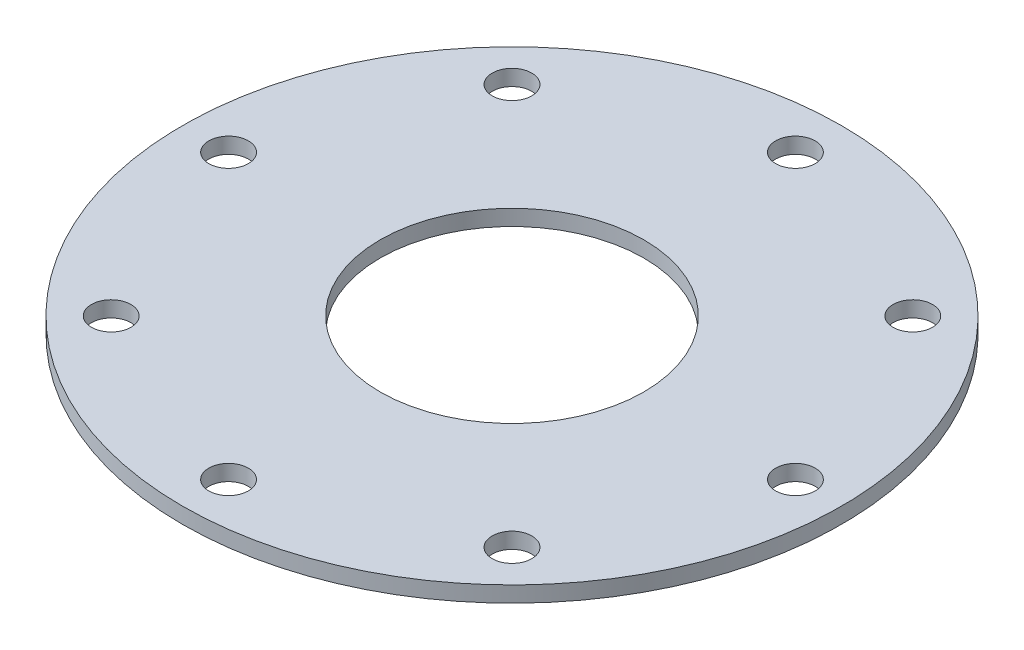
ISO-10303-21;
HEADER;
FILE_DESCRIPTION(('STEP AP214'),'2;1');
FILE_NAME('part.step','',(''),(''),'','','');
FILE_SCHEMA(('AUTOMOTIVE_DESIGN { 1 0 10303 214 1 1 1 1 }'));
ENDSEC;
DATA;
#1=APPLICATION_CONTEXT('core data for automotive mechanical design processes');
#2=APPLICATION_PROTOCOL_DEFINITION('international standard','automotive_design',2000,#1);
#3=PRODUCT_CONTEXT('',#1,'mechanical');
#4=PRODUCT('Part','Part','',(#3));
#5=PRODUCT_RELATED_PRODUCT_CATEGORY('part','',(#4));
#6=PRODUCT_DEFINITION_FORMATION('','',#4);
#7=PRODUCT_DEFINITION_CONTEXT('part definition',#1,'design');
#8=PRODUCT_DEFINITION('design','',#6,#7);
#9=PRODUCT_DEFINITION_SHAPE('','',#8);
#10=(LENGTH_UNIT() NAMED_UNIT(*) SI_UNIT(.MILLI.,.METRE.));
#11=(NAMED_UNIT(*) PLANE_ANGLE_UNIT() SI_UNIT($,.RADIAN.));
#12=(NAMED_UNIT(*) SI_UNIT($,.STERADIAN.) SOLID_ANGLE_UNIT());
#13=UNCERTAINTY_MEASURE_WITH_UNIT(LENGTH_MEASURE(1.E-05),#10,'distance_accuracy_value','');
#14=(GEOMETRIC_REPRESENTATION_CONTEXT(3) GLOBAL_UNCERTAINTY_ASSIGNED_CONTEXT((#13)) GLOBAL_UNIT_ASSIGNED_CONTEXT((#10,
#11,#12)) REPRESENTATION_CONTEXT('',''));
#15=CARTESIAN_POINT('',(0.,0.,0.));
#16=DIRECTION('',(0.,0.,1.));
#17=DIRECTION('',(1.,0.,0.));
#18=AXIS2_PLACEMENT_3D('',#15,#16,#17);
#19=CARTESIAN_POINT('',(0.,6.,0.));
#20=DIRECTION('',(0.,-1.,0.));
#21=DIRECTION('',(0.,0.,-1.));
#22=AXIS2_PLACEMENT_3D('',#19,#20,#21);
#23=CYLINDRICAL_SURFACE('',#22,125.);
#24=CARTESIAN_POINT('',(0.,6.,0.));
#25=DIRECTION('',(0.,1.,0.));
#26=DIRECTION('',(0.,0.,1.));
#27=AXIS2_PLACEMENT_3D('',#24,#25,#26);
#28=CIRCLE('',#27,125.);
#29=CARTESIAN_POINT('',(0.,6.,125.));
#30=VERTEX_POINT('',#29);
#31=EDGE_CURVE('E10',#30,#30,#28,.T.);
#32=ORIENTED_EDGE('',*,*,#31,.F.);
#33=EDGE_LOOP('',(#32));
#34=FACE_BOUND('',#33,.T.);
#35=CARTESIAN_POINT('',(0.,0.,0.));
#36=DIRECTION('',(0.,1.,0.));
#37=DIRECTION('',(0.,0.,1.));
#38=AXIS2_PLACEMENT_3D('',#35,#36,#37);
#39=CIRCLE('',#38,125.);
#40=CARTESIAN_POINT('',(0.,0.,125.));
#41=VERTEX_POINT('',#40);
#42=EDGE_CURVE('E35',#41,#41,#39,.T.);
#43=ORIENTED_EDGE('',*,*,#42,.T.);
#44=EDGE_LOOP('',(#43));
#45=FACE_BOUND('',#44,.T.);
#46=ADVANCED_FACE('F32',(#34,#45),#23,.T.);
#47=CARTESIAN_POINT('',(0.,6.,0.));
#48=DIRECTION('',(0.,1.,0.));
#49=DIRECTION('',(0.,0.,1.));
#50=AXIS2_PLACEMENT_3D('',#47,#48,#49);
#51=PLANE('',#50);
#52=CARTESIAN_POINT('',(-107.5,6.,3.75334243925637E-13));
#53=DIRECTION('',(0.,1.,0.));
#54=DIRECTION('',(1.,0.,0.));
#55=AXIS2_PLACEMENT_3D('',#52,#53,#54);
#56=CIRCLE('',#55,7.5);
#57=CARTESIAN_POINT('',(-100.,6.,3.49148133884313E-13));
#58=VERTEX_POINT('',#57);
#59=EDGE_CURVE('E61',#58,#58,#56,.T.);
#60=ORIENTED_EDGE('',*,*,#59,.F.);
#61=EDGE_LOOP('',(#60));
#62=FACE_BOUND('',#61,.T.);
#63=CARTESIAN_POINT('',(-76.0139789775534,6.,76.0139789775543));
#64=DIRECTION('',(0.,1.,0.));
#65=DIRECTION('',(0.707106781186544,0.,-0.707106781186551));
#66=AXIS2_PLACEMENT_3D('',#63,#64,#65);
#67=CIRCLE('',#66,7.5);
#68=CARTESIAN_POINT('',(-70.7106781186544,6.,70.7106781186551));
#69=VERTEX_POINT('',#68);
#70=EDGE_CURVE('E76',#69,#69,#67,.T.);
#71=ORIENTED_EDGE('',*,*,#70,.F.);
#72=EDGE_LOOP('',(#71));
#73=FACE_BOUND('',#72,.T.);
#74=CARTESIAN_POINT('',(0.,6.,107.5));
#75=DIRECTION('',(0.,1.,0.));
#76=DIRECTION('',(0.,0.,-1.));
#77=AXIS2_PLACEMENT_3D('',#74,#75,#76);
#78=CIRCLE('',#77,7.5);
#79=CARTESIAN_POINT('',(0.,6.,100.));
#80=VERTEX_POINT('',#79);
#81=EDGE_CURVE('E70',#80,#80,#78,.T.);
#82=ORIENTED_EDGE('',*,*,#81,.F.);
#83=EDGE_LOOP('',(#82));
#84=FACE_BOUND('',#83,.T.);
#85=CARTESIAN_POINT('',(76.0139789775545,6.,76.0139789775532));
#86=DIRECTION('',(0.,1.,0.));
#87=DIRECTION('',(-0.707106781186554,0.,-0.707106781186541));
#88=AXIS2_PLACEMENT_3D('',#85,#86,#87);
#89=CIRCLE('',#88,7.5);
#90=CARTESIAN_POINT('',(70.7106781186554,6.,70.7106781186541));
#91=VERTEX_POINT('',#90);
#92=EDGE_CURVE('E62',#91,#91,#89,.T.);
#93=ORIENTED_EDGE('',*,*,#92,.F.);
#94=EDGE_LOOP('',(#93));
#95=FACE_BOUND('',#94,.T.);
#96=CARTESIAN_POINT('',(107.5,6.,-1.12600273177691E-12));
#97=DIRECTION('',(0.,1.,0.));
#98=DIRECTION('',(-1.,0.,0.));
#99=AXIS2_PLACEMENT_3D('',#96,#97,#98);
#100=CIRCLE('',#99,7.5);
#101=CARTESIAN_POINT('',(100.,6.,-1.04744440165294E-12));
#102=VERTEX_POINT('',#101);
#103=EDGE_CURVE('E69',#102,#102,#100,.T.);
#104=ORIENTED_EDGE('',*,*,#103,.F.);
#105=EDGE_LOOP('',(#104));
#106=FACE_BOUND('',#105,.T.);
#107=CARTESIAN_POINT('',(76.0139789775529,6.,-76.0139789775548));
#108=DIRECTION('',(0.,1.,0.));
#109=DIRECTION('',(-0.707106781186539,0.,0.707106781186556));
#110=AXIS2_PLACEMENT_3D('',#107,#108,#109);
#111=CIRCLE('',#110,7.5);
#112=CARTESIAN_POINT('',(70.7106781186539,6.,-70.7106781186556));
#113=VERTEX_POINT('',#112);
#114=EDGE_CURVE('E86',#113,#113,#111,.T.);
#115=ORIENTED_EDGE('',*,*,#114,.F.);
#116=EDGE_LOOP('',(#115));
#117=FACE_BOUND('',#116,.T.);
#118=CARTESIAN_POINT('',(-76.013978977554,6.,-76.0139789775537));
#119=DIRECTION('',(0.,1.,0.));
#120=DIRECTION('',(0.707106781186549,0.,0.707106781186546));
#121=AXIS2_PLACEMENT_3D('',#118,#119,#120);
#122=CIRCLE('',#121,7.5);
#123=CARTESIAN_POINT('',(-70.7106781186549,6.,-70.7106781186546));
#124=VERTEX_POINT('',#123);
#125=EDGE_CURVE('E53',#124,#124,#122,.T.);
#126=ORIENTED_EDGE('',*,*,#125,.F.);
#127=EDGE_LOOP('',(#126));
#128=FACE_BOUND('',#127,.T.);
#129=CARTESIAN_POINT('',(0.,6.,-107.5));
#130=DIRECTION('',(0.,1.,0.));
#131=DIRECTION('',(0.,0.,1.));
#132=AXIS2_PLACEMENT_3D('',#129,#130,#131);
#133=CIRCLE('',#132,7.5);
#134=CARTESIAN_POINT('',(0.,6.,-100.));
#135=VERTEX_POINT('',#134);
#136=EDGE_CURVE('E50',#135,#135,#133,.T.);
#137=ORIENTED_EDGE('',*,*,#136,.F.);
#138=EDGE_LOOP('',(#137));
#139=FACE_BOUND('',#138,.T.);
#140=CARTESIAN_POINT('',(0.,6.,0.));
#141=DIRECTION('',(0.,1.,0.));
#142=DIRECTION('',(0.,0.,1.));
#143=AXIS2_PLACEMENT_3D('',#140,#141,#142);
#144=CIRCLE('',#143,50.);
#145=CARTESIAN_POINT('',(0.,6.,50.));
#146=VERTEX_POINT('',#145);
#147=EDGE_CURVE('E44',#146,#146,#144,.T.);
#148=ORIENTED_EDGE('',*,*,#147,.F.);
#149=EDGE_LOOP('',(#148));
#150=FACE_BOUND('',#149,.T.);
#151=ORIENTED_EDGE('',*,*,#31,.T.);
#152=EDGE_LOOP('',(#151));
#153=FACE_BOUND('',#152,.T.);
#154=ADVANCED_FACE('F109',(#62,#73,#84,#95,#106,#117,#128,#139,#150,#153),#51,.T.);
#155=CARTESIAN_POINT('',(0.,0.,0.));
#156=DIRECTION('',(0.,1.,0.));
#157=DIRECTION('',(0.,0.,1.));
#158=AXIS2_PLACEMENT_3D('',#155,#156,#157);
#159=PLANE('',#158);
#160=CARTESIAN_POINT('',(-107.5,0.,3.75334243925637E-13));
#161=DIRECTION('',(0.,1.,0.));
#162=DIRECTION('',(1.,0.,0.));
#163=AXIS2_PLACEMENT_3D('',#160,#161,#162);
#164=CIRCLE('',#163,7.5);
#165=CARTESIAN_POINT('',(-100.,0.,3.49148133884313E-13));
#166=VERTEX_POINT('',#165);
#167=EDGE_CURVE('E79',#166,#166,#164,.T.);
#168=ORIENTED_EDGE('',*,*,#167,.T.);
#169=EDGE_LOOP('',(#168));
#170=FACE_BOUND('',#169,.T.);
#171=CARTESIAN_POINT('',(-76.0139789775534,0.,76.0139789775543));
#172=DIRECTION('',(0.,1.,0.));
#173=DIRECTION('',(0.707106781186544,0.,-0.707106781186551));
#174=AXIS2_PLACEMENT_3D('',#171,#172,#173);
#175=CIRCLE('',#174,7.5);
#176=CARTESIAN_POINT('',(-70.7106781186544,0.,70.7106781186551));
#177=VERTEX_POINT('',#176);
#178=EDGE_CURVE('E73',#177,#177,#175,.T.);
#179=ORIENTED_EDGE('',*,*,#178,.T.);
#180=EDGE_LOOP('',(#179));
#181=FACE_BOUND('',#180,.T.);
#182=CARTESIAN_POINT('',(0.,0.,107.5));
#183=DIRECTION('',(0.,1.,0.));
#184=DIRECTION('',(0.,0.,-1.));
#185=AXIS2_PLACEMENT_3D('',#182,#183,#184);
#186=CIRCLE('',#185,7.5);
#187=CARTESIAN_POINT('',(0.,0.,100.));
#188=VERTEX_POINT('',#187);
#189=EDGE_CURVE('E65',#188,#188,#186,.T.);
#190=ORIENTED_EDGE('',*,*,#189,.T.);
#191=EDGE_LOOP('',(#190));
#192=FACE_BOUND('',#191,.T.);
#193=CARTESIAN_POINT('',(76.0139789775545,0.,76.0139789775532));
#194=DIRECTION('',(0.,1.,0.));
#195=DIRECTION('',(-0.707106781186554,0.,-0.707106781186541));
#196=AXIS2_PLACEMENT_3D('',#193,#194,#195);
#197=CIRCLE('',#196,7.5);
#198=CARTESIAN_POINT('',(70.7106781186554,0.,70.7106781186541));
#199=VERTEX_POINT('',#198);
#200=EDGE_CURVE('E66',#199,#199,#197,.T.);
#201=ORIENTED_EDGE('',*,*,#200,.T.);
#202=EDGE_LOOP('',(#201));
#203=FACE_BOUND('',#202,.T.);
#204=CARTESIAN_POINT('',(107.5,0.,-1.12600273177691E-12));
#205=DIRECTION('',(0.,1.,0.));
#206=DIRECTION('',(-1.,0.,0.));
#207=AXIS2_PLACEMENT_3D('',#204,#205,#206);
#208=CIRCLE('',#207,7.5);
#209=CARTESIAN_POINT('',(100.,0.,-1.04744440165294E-12));
#210=VERTEX_POINT('',#209);
#211=EDGE_CURVE('E89',#210,#210,#208,.T.);
#212=ORIENTED_EDGE('',*,*,#211,.T.);
#213=EDGE_LOOP('',(#212));
#214=FACE_BOUND('',#213,.T.);
#215=CARTESIAN_POINT('',(76.0139789775529,0.,-76.0139789775548));
#216=DIRECTION('',(0.,1.,0.));
#217=DIRECTION('',(-0.707106781186539,0.,0.707106781186556));
#218=AXIS2_PLACEMENT_3D('',#215,#216,#217);
#219=CIRCLE('',#218,7.5);
#220=CARTESIAN_POINT('',(70.7106781186539,0.,-70.7106781186556));
#221=VERTEX_POINT('',#220);
#222=EDGE_CURVE('E90',#221,#221,#219,.T.);
#223=ORIENTED_EDGE('',*,*,#222,.T.);
#224=EDGE_LOOP('',(#223));
#225=FACE_BOUND('',#224,.T.);
#226=CARTESIAN_POINT('',(-76.013978977554,0.,-76.0139789775537));
#227=DIRECTION('',(0.,1.,0.));
#228=DIRECTION('',(0.707106781186549,0.,0.707106781186546));
#229=AXIS2_PLACEMENT_3D('',#226,#227,#228);
#230=CIRCLE('',#229,7.5);
#231=CARTESIAN_POINT('',(-70.7106781186549,0.,-70.7106781186546));
#232=VERTEX_POINT('',#231);
#233=EDGE_CURVE('E58',#232,#232,#230,.T.);
#234=ORIENTED_EDGE('',*,*,#233,.T.);
#235=EDGE_LOOP('',(#234));
#236=FACE_BOUND('',#235,.T.);
#237=CARTESIAN_POINT('',(0.,0.,-107.5));
#238=DIRECTION('',(0.,1.,0.));
#239=DIRECTION('',(0.,0.,1.));
#240=AXIS2_PLACEMENT_3D('',#237,#238,#239);
#241=CIRCLE('',#240,7.5);
#242=CARTESIAN_POINT('',(0.,0.,-100.));
#243=VERTEX_POINT('',#242);
#244=EDGE_CURVE('E47',#243,#243,#241,.T.);
#245=ORIENTED_EDGE('',*,*,#244,.T.);
#246=EDGE_LOOP('',(#245));
#247=FACE_BOUND('',#246,.T.);
#248=CARTESIAN_POINT('',(0.,0.,0.));
#249=DIRECTION('',(0.,1.,0.));
#250=DIRECTION('',(0.,0.,1.));
#251=AXIS2_PLACEMENT_3D('',#248,#249,#250);
#252=CIRCLE('',#251,50.);
#253=CARTESIAN_POINT('',(0.,0.,50.));
#254=VERTEX_POINT('',#253);
#255=EDGE_CURVE('E42',#254,#254,#252,.T.);
#256=ORIENTED_EDGE('',*,*,#255,.T.);
#257=EDGE_LOOP('',(#256));
#258=FACE_BOUND('',#257,.T.);
#259=ORIENTED_EDGE('',*,*,#42,.F.);
#260=EDGE_LOOP('',(#259));
#261=FACE_BOUND('',#260,.T.);
#262=ADVANCED_FACE('F98',(#170,#181,#192,#203,#214,#225,#236,#247,#258,#261),#159,.F.);
#263=CARTESIAN_POINT('',(0.,0.,0.));
#264=DIRECTION('',(0.,1.,0.));
#265=DIRECTION('',(0.,0.,1.));
#266=AXIS2_PLACEMENT_3D('',#263,#264,#265);
#267=CYLINDRICAL_SURFACE('',#266,50.);
#268=ORIENTED_EDGE('',*,*,#255,.F.);
#269=EDGE_LOOP('',(#268));
#270=FACE_BOUND('',#269,.T.);
#271=ORIENTED_EDGE('',*,*,#147,.T.);
#272=EDGE_LOOP('',(#271));
#273=FACE_BOUND('',#272,.T.);
#274=ADVANCED_FACE('F122',(#270,#273),#267,.F.);
#275=CARTESIAN_POINT('',(0.,0.,-107.5));
#276=DIRECTION('',(0.,1.,0.));
#277=DIRECTION('',(0.,0.,1.));
#278=AXIS2_PLACEMENT_3D('',#275,#276,#277);
#279=CYLINDRICAL_SURFACE('',#278,7.5);
#280=ORIENTED_EDGE('',*,*,#244,.F.);
#281=EDGE_LOOP('',(#280));
#282=FACE_BOUND('',#281,.T.);
#283=ORIENTED_EDGE('',*,*,#136,.T.);
#284=EDGE_LOOP('',(#283));
#285=FACE_BOUND('',#284,.T.);
#286=ADVANCED_FACE('F124',(#282,#285),#279,.F.);
#287=CARTESIAN_POINT('',(-76.013978977554,0.,-76.0139789775537));
#288=DIRECTION('',(0.,1.,0.));
#289=DIRECTION('',(0.707106781186549,0.,0.707106781186546));
#290=AXIS2_PLACEMENT_3D('',#287,#288,#289);
#291=CYLINDRICAL_SURFACE('',#290,7.5);
#292=ORIENTED_EDGE('',*,*,#233,.F.);
#293=EDGE_LOOP('',(#292));
#294=FACE_BOUND('',#293,.T.);
#295=ORIENTED_EDGE('',*,*,#125,.T.);
#296=EDGE_LOOP('',(#295));
#297=FACE_BOUND('',#296,.T.);
#298=ADVANCED_FACE('F131',(#294,#297),#291,.F.);
#299=CARTESIAN_POINT('',(76.0139789775529,0.,-76.0139789775548));
#300=DIRECTION('',(0.,1.,0.));
#301=DIRECTION('',(-0.707106781186539,0.,0.707106781186556));
#302=AXIS2_PLACEMENT_3D('',#299,#300,#301);
#303=CYLINDRICAL_SURFACE('',#302,7.5);
#304=ORIENTED_EDGE('',*,*,#222,.F.);
#305=EDGE_LOOP('',(#304));
#306=FACE_BOUND('',#305,.T.);
#307=ORIENTED_EDGE('',*,*,#114,.T.);
#308=EDGE_LOOP('',(#307));
#309=FACE_BOUND('',#308,.T.);
#310=ADVANCED_FACE('F105',(#306,#309),#303,.F.);
#311=CARTESIAN_POINT('',(107.5,0.,-1.12600273177691E-12));
#312=DIRECTION('',(0.,1.,0.));
#313=DIRECTION('',(-1.,0.,0.));
#314=AXIS2_PLACEMENT_3D('',#311,#312,#313);
#315=CYLINDRICAL_SURFACE('',#314,7.5);
#316=ORIENTED_EDGE('',*,*,#211,.F.);
#317=EDGE_LOOP('',(#316));
#318=FACE_BOUND('',#317,.T.);
#319=ORIENTED_EDGE('',*,*,#103,.T.);
#320=EDGE_LOOP('',(#319));
#321=FACE_BOUND('',#320,.T.);
#322=ADVANCED_FACE('F101',(#318,#321),#315,.F.);
#323=CARTESIAN_POINT('',(76.0139789775545,0.,76.0139789775532));
#324=DIRECTION('',(0.,1.,0.));
#325=DIRECTION('',(-0.707106781186554,0.,-0.707106781186541));
#326=AXIS2_PLACEMENT_3D('',#323,#324,#325);
#327=CYLINDRICAL_SURFACE('',#326,7.5);
#328=ORIENTED_EDGE('',*,*,#200,.F.);
#329=EDGE_LOOP('',(#328));
#330=FACE_BOUND('',#329,.T.);
#331=ORIENTED_EDGE('',*,*,#92,.T.);
#332=EDGE_LOOP('',(#331));
#333=FACE_BOUND('',#332,.T.);
#334=ADVANCED_FACE('F104',(#330,#333),#327,.F.);
#335=CARTESIAN_POINT('',(0.,0.,107.5));
#336=DIRECTION('',(0.,1.,0.));
#337=DIRECTION('',(0.,0.,-1.));
#338=AXIS2_PLACEMENT_3D('',#335,#336,#337);
#339=CYLINDRICAL_SURFACE('',#338,7.5);
#340=ORIENTED_EDGE('',*,*,#189,.F.);
#341=EDGE_LOOP('',(#340));
#342=FACE_BOUND('',#341,.T.);
#343=ORIENTED_EDGE('',*,*,#81,.T.);
#344=EDGE_LOOP('',(#343));
#345=FACE_BOUND('',#344,.T.);
#346=ADVANCED_FACE('F187',(#342,#345),#339,.F.);
#347=CARTESIAN_POINT('',(-76.0139789775534,0.,76.0139789775543));
#348=DIRECTION('',(0.,1.,0.));
#349=DIRECTION('',(0.707106781186544,0.,-0.707106781186551));
#350=AXIS2_PLACEMENT_3D('',#347,#348,#349);
#351=CYLINDRICAL_SURFACE('',#350,7.5);
#352=ORIENTED_EDGE('',*,*,#178,.F.);
#353=EDGE_LOOP('',(#352));
#354=FACE_BOUND('',#353,.T.);
#355=ORIENTED_EDGE('',*,*,#70,.T.);
#356=EDGE_LOOP('',(#355));
#357=FACE_BOUND('',#356,.T.);
#358=ADVANCED_FACE('F197',(#354,#357),#351,.F.);
#359=CARTESIAN_POINT('',(-107.5,0.,3.75334243925637E-13));
#360=DIRECTION('',(0.,1.,0.));
#361=DIRECTION('',(1.,0.,0.));
#362=AXIS2_PLACEMENT_3D('',#359,#360,#361);
#363=CYLINDRICAL_SURFACE('',#362,7.5);
#364=ORIENTED_EDGE('',*,*,#167,.F.);
#365=EDGE_LOOP('',(#364));
#366=FACE_BOUND('',#365,.T.);
#367=ORIENTED_EDGE('',*,*,#59,.T.);
#368=EDGE_LOOP('',(#367));
#369=FACE_BOUND('',#368,.T.);
#370=ADVANCED_FACE('F207',(#366,#369),#363,.F.);
#371=CLOSED_SHELL('',(#46,#154,#262,#274,#286,#298,#310,#322,#334,#346,#358,#370));
#372=MANIFOLD_SOLID_BREP('B2',#371);
#373=ADVANCED_BREP_SHAPE_REPRESENTATION('',(#18,#372),#14);
#374=SHAPE_DEFINITION_REPRESENTATION(#9,#373);
ENDSEC;
END-ISO-10303-21;
